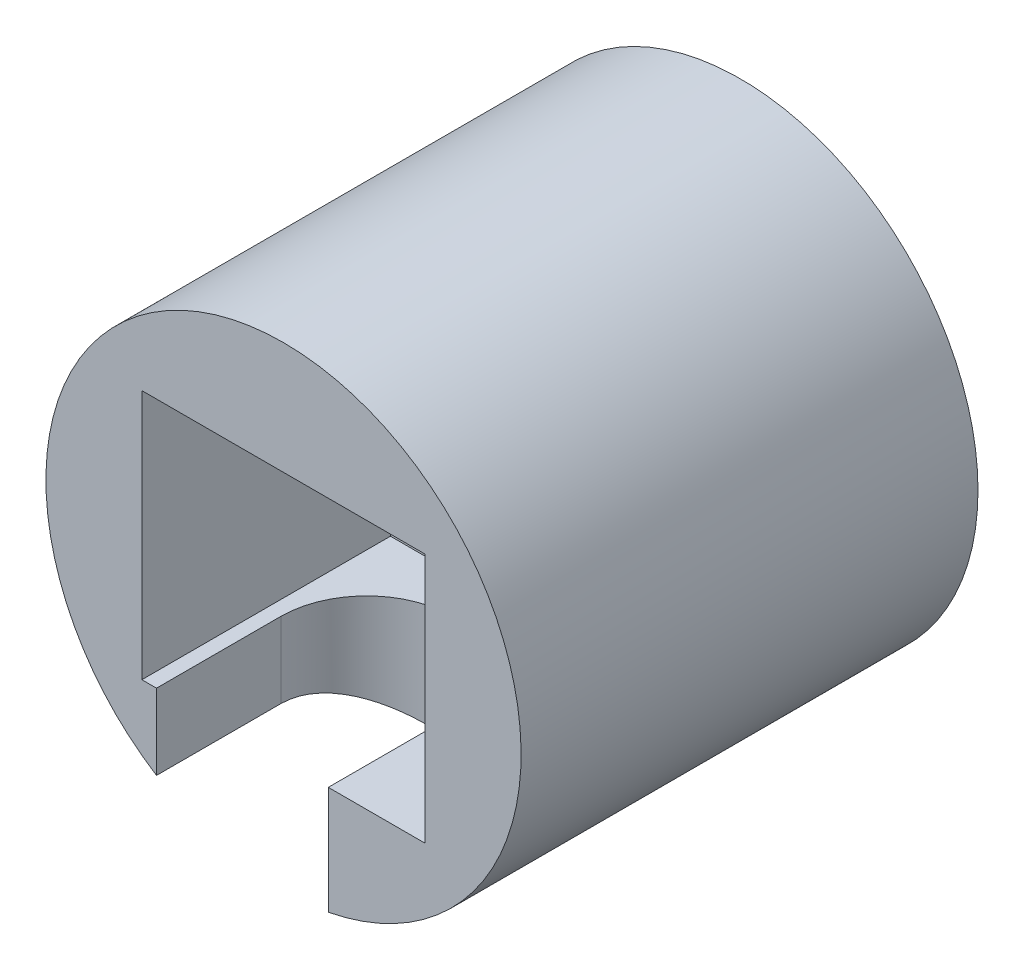
ISO-10303-21;
HEADER;
FILE_DESCRIPTION(('STEP AP214'),'2;1');
FILE_NAME('part.step','',(''),(''),'','','');
FILE_SCHEMA(('AUTOMOTIVE_DESIGN { 1 0 10303 214 1 1 1 1 }'));
ENDSEC;
DATA;
#1=APPLICATION_CONTEXT('core data for automotive mechanical design processes');
#2=APPLICATION_PROTOCOL_DEFINITION('international standard','automotive_design',2000,#1);
#3=PRODUCT_CONTEXT('',#1,'mechanical');
#4=PRODUCT('Part','Part','',(#3));
#5=PRODUCT_RELATED_PRODUCT_CATEGORY('part','',(#4));
#6=PRODUCT_DEFINITION_FORMATION('','',#4);
#7=PRODUCT_DEFINITION_CONTEXT('part definition',#1,'design');
#8=PRODUCT_DEFINITION('design','',#6,#7);
#9=PRODUCT_DEFINITION_SHAPE('','',#8);
#10=(LENGTH_UNIT() NAMED_UNIT(*) SI_UNIT(.MILLI.,.METRE.));
#11=(NAMED_UNIT(*) PLANE_ANGLE_UNIT() SI_UNIT($,.RADIAN.));
#12=(NAMED_UNIT(*) SI_UNIT($,.STERADIAN.) SOLID_ANGLE_UNIT());
#13=UNCERTAINTY_MEASURE_WITH_UNIT(LENGTH_MEASURE(1.E-05),#10,'distance_accuracy_value','');
#14=(GEOMETRIC_REPRESENTATION_CONTEXT(3) GLOBAL_UNCERTAINTY_ASSIGNED_CONTEXT((#13)) GLOBAL_UNIT_ASSIGNED_CONTEXT((#10,
#11,#12)) REPRESENTATION_CONTEXT('',''));
#15=CARTESIAN_POINT('',(0.,0.,0.));
#16=DIRECTION('',(0.,0.,1.));
#17=DIRECTION('',(1.,0.,0.));
#18=AXIS2_PLACEMENT_3D('',#15,#16,#17);
#19=CARTESIAN_POINT('',(0.,0.,25.));
#20=DIRECTION('',(0.,0.,1.));
#21=DIRECTION('',(1.,0.,0.));
#22=AXIS2_PLACEMENT_3D('',#19,#20,#21);
#23=PLANE('',#22);
#24=DIRECTION('',(0.,1.,0.));
#25=VECTOR('',#24,1.);
#26=CARTESIAN_POINT('',(2.44999999999998,-13.001,25.0000000000001));
#27=LINE('',#26,#25);
#28=CARTESIAN_POINT('',(2.44999999999998,-12.767047426872,25.0000000000001));
#29=VERTEX_POINT('',#28);
#30=CARTESIAN_POINT('',(2.44999999999998,-6.85,25.0000000000001));
#31=VERTEX_POINT('',#30);
#32=EDGE_CURVE('E116',#29,#31,#27,.T.);
#33=ORIENTED_EDGE('',*,*,#32,.F.);
#34=CARTESIAN_POINT('',(0.,0.,25.));
#35=DIRECTION('',(0.,0.,1.));
#36=DIRECTION('',(1.,0.,0.));
#37=AXIS2_PLACEMENT_3D('',#34,#35,#36);
#38=CIRCLE('',#37,13.);
#39=CARTESIAN_POINT('',(-6.95000000000002,-10.986241395491,25.0000000000001));
#40=VERTEX_POINT('',#39);
#41=EDGE_CURVE('E122',#29,#40,#38,.T.);
#42=ORIENTED_EDGE('',*,*,#41,.T.);
#43=DIRECTION('',(0.,1.,0.));
#44=VECTOR('',#43,1.);
#45=CARTESIAN_POINT('',(-6.95000000000002,-13.001,25.0000000000001));
#46=LINE('',#45,#44);
#47=CARTESIAN_POINT('',(-6.95000000000002,-6.85,25.0000000000001));
#48=VERTEX_POINT('',#47);
#49=EDGE_CURVE('E103',#40,#48,#46,.T.);
#50=ORIENTED_EDGE('',*,*,#49,.T.);
#51=DIRECTION('',(1.,0.,0.));
#52=VECTOR('',#51,1.);
#53=CARTESIAN_POINT('',(-7.75000000000015,-6.85,25.0000000000001));
#54=LINE('',#53,#52);
#55=CARTESIAN_POINT('',(-7.75000000000015,-6.85,25.0000000000001));
#56=VERTEX_POINT('',#55);
#57=EDGE_CURVE('E156',#56,#48,#54,.T.);
#58=ORIENTED_EDGE('',*,*,#57,.F.);
#59=DIRECTION('',(0.,1.,0.));
#60=VECTOR('',#59,1.);
#61=CARTESIAN_POINT('',(-7.75000000000015,-6.85,25.0000000000001));
#62=LINE('',#61,#60);
#63=CARTESIAN_POINT('',(-7.75000000000015,6.85,25.0000000000001));
#64=VERTEX_POINT('',#63);
#65=EDGE_CURVE('E145',#56,#64,#62,.T.);
#66=ORIENTED_EDGE('',*,*,#65,.T.);
#67=DIRECTION('',(1.,0.,0.));
#68=VECTOR('',#67,1.);
#69=CARTESIAN_POINT('',(-7.75000000000015,6.85,25.0000000000001));
#70=LINE('',#69,#68);
#71=CARTESIAN_POINT('',(7.74999999999986,6.85,25.));
#72=VERTEX_POINT('',#71);
#73=EDGE_CURVE('E125',#64,#72,#70,.T.);
#74=ORIENTED_EDGE('',*,*,#73,.T.);
#75=DIRECTION('',(0.,1.,0.));
#76=VECTOR('',#75,1.);
#77=CARTESIAN_POINT('',(7.74999999999986,-6.85,25.0000000000001));
#78=LINE('',#77,#76);
#79=CARTESIAN_POINT('',(7.74999999999986,-6.85,25.0000000000001));
#80=VERTEX_POINT('',#79);
#81=EDGE_CURVE('E177',#80,#72,#78,.T.);
#82=ORIENTED_EDGE('',*,*,#81,.F.);
#83=EDGE_CURVE('E163',#31,#80,#54,.T.);
#84=ORIENTED_EDGE('',*,*,#83,.F.);
#85=EDGE_LOOP('',(#33,#42,#50,#58,#66,#74,#82,#84));
#86=FACE_BOUND('',#85,.T.);
#87=ADVANCED_FACE('F39',(#86),#23,.T.);
#88=CARTESIAN_POINT('',(0.,0.,0.));
#89=DIRECTION('',(0.,0.,1.));
#90=DIRECTION('',(1.,0.,0.));
#91=AXIS2_PLACEMENT_3D('',#88,#89,#90);
#92=PLANE('',#91);
#93=CARTESIAN_POINT('',(0.,0.,0.));
#94=DIRECTION('',(0.,0.,1.));
#95=DIRECTION('',(1.,0.,0.));
#96=AXIS2_PLACEMENT_3D('',#93,#94,#95);
#97=CIRCLE('',#96,13.);
#98=CARTESIAN_POINT('',(13.,0.,0.));
#99=VERTEX_POINT('',#98);
#100=EDGE_CURVE('E131',#99,#99,#97,.T.);
#101=ORIENTED_EDGE('',*,*,#100,.F.);
#102=EDGE_LOOP('',(#101));
#103=FACE_BOUND('',#102,.T.);
#104=CARTESIAN_POINT('',(0.,0.,0.));
#105=DIRECTION('',(0.,0.,1.));
#106=DIRECTION('',(1.,0.,0.));
#107=AXIS2_PLACEMENT_3D('',#104,#105,#106);
#108=CIRCLE('',#107,3.);
#109=CARTESIAN_POINT('',(3.,0.,0.));
#110=VERTEX_POINT('',#109);
#111=EDGE_CURVE('E137',#110,#110,#108,.T.);
#112=ORIENTED_EDGE('',*,*,#111,.T.);
#113=EDGE_LOOP('',(#112));
#114=FACE_BOUND('',#113,.T.);
#115=ADVANCED_FACE('F244',(#103,#114),#92,.F.);
#116=CARTESIAN_POINT('',(0.,0.,25.));
#117=DIRECTION('',(0.,0.,-1.));
#118=DIRECTION('',(-1.,0.,0.));
#119=AXIS2_PLACEMENT_3D('',#116,#117,#118);
#120=CYLINDRICAL_SURFACE('',#119,13.);
#121=ORIENTED_EDGE('',*,*,#41,.F.);
#122=DIRECTION('',(0.,0.,-1.));
#123=VECTOR('',#122,1.);
#124=CARTESIAN_POINT('',(2.44999999999998,-12.767047426872,25.));
#125=LINE('',#124,#123);
#126=CARTESIAN_POINT('',(2.44999999999998,-12.767047426872,18.2));
#127=VERTEX_POINT('',#126);
#128=EDGE_CURVE('E126',#127,#29,#125,.F.);
#129=ORIENTED_EDGE('',*,*,#128,.F.);
#130=CARTESIAN_POINT('',(-6.95000000000002,-10.986241395491,18.2));
#131=CARTESIAN_POINT('',(-6.95002293277047,-10.9862101413099,18.0794937144867));
#132=CARTESIAN_POINT('',(-6.94536617343314,-10.9891724451402,17.9590067442839));
#133=CARTESIAN_POINT('',(-6.92687250748531,-11.0008478791062,17.7190914736104));
#134=CARTESIAN_POINT('',(-6.91304120923049,-11.0095574959177,17.5996625715161));
#135=CARTESIAN_POINT('',(-6.8764880646057,-11.0324225139389,17.3634497306772));
#136=CARTESIAN_POINT('',(-6.85382043977003,-11.0465446938168,17.246654170918));
#137=CARTESIAN_POINT('',(-6.79991842603917,-11.0798064516316,17.0158087461879));
#138=CARTESIAN_POINT('',(-6.76868308932211,-11.0989465846802,16.9017591865187));
#139=CARTESIAN_POINT('',(-6.66281770067882,-11.1630506256045,16.5653405251522));
#140=CARTESIAN_POINT('',(-6.57591365208651,-11.2147730665416,16.347978720706));
#141=CARTESIAN_POINT('',(-6.37269585525324,-11.3314796520538,15.9312206299358));
#142=CARTESIAN_POINT('',(-6.25633658705203,-11.3964842926187,15.7318528043078));
#143=CARTESIAN_POINT('',(-5.98638228962754,-11.5407339649325,15.3379804456123));
#144=CARTESIAN_POINT('',(-5.83045630953931,-11.620720972423,15.1453444605947));
#145=CARTESIAN_POINT('',(-5.49146908190111,-11.7847058657888,14.7877139107999));
#146=CARTESIAN_POINT('',(-5.30839821110796,-11.8687051668902,14.6227291931531));
#147=CARTESIAN_POINT('',(-4.89530506441212,-12.0454121427351,14.3054190514298));
#148=CARTESIAN_POINT('',(-4.66229412632271,-12.1379850223376,14.1568510474252));
#149=CARTESIAN_POINT('',(-4.29446133992722,-12.2708906279301,13.9656936327974));
#150=CARTESIAN_POINT('',(-4.16871494697715,-12.3142249526274,13.9072308195135));
#151=CARTESIAN_POINT('',(-3.91180103206324,-12.3982265963457,13.801399590448));
#152=CARTESIAN_POINT('',(-3.78063607415363,-12.438895153761,13.7540259964402));
#153=CARTESIAN_POINT('',(-3.51487079510043,-12.5165768066713,13.6712794297962));
#154=CARTESIAN_POINT('',(-3.38031006852302,-12.5536185123949,13.6358060698476));
#155=CARTESIAN_POINT('',(-3.10767087058296,-12.6238734863184,13.5768149897425));
#156=CARTESIAN_POINT('',(-2.96959403091655,-12.6570884921922,13.5532918264199));
#157=CARTESIAN_POINT('',(-2.6909841608342,-12.7192361932959,13.5186291490684));
#158=CARTESIAN_POINT('',(-2.55045192035152,-12.7481702384011,13.5074857242078));
#159=CARTESIAN_POINT('',(-2.26808705238904,-12.8014223644072,13.4979130110289));
#160=CARTESIAN_POINT('',(-2.12625454545391,-12.8257408687571,13.499482555792));
#161=CARTESIAN_POINT('',(-1.8546471069233,-12.8676934934988,13.5148537955609));
#162=CARTESIAN_POINT('',(-1.72487236520933,-12.8857201580522,13.5276040613335));
#163=CARTESIAN_POINT('',(-1.46629496870776,-12.9176992092879,13.5639612124383));
#164=CARTESIAN_POINT('',(-1.33749265320087,-12.9316502326621,13.5875717237555));
#165=CARTESIAN_POINT('',(-1.08203539847925,-12.9555258209228,13.6455511373607));
#166=CARTESIAN_POINT('',(-0.955379224400016,-12.9654527821934,13.6799136150363));
#167=CARTESIAN_POINT('',(-0.705120754444983,-12.9814688044434,13.7592136801633));
#168=CARTESIAN_POINT('',(-0.58151959487547,-12.9875564574414,13.8041551389351));
#169=CARTESIAN_POINT('',(-0.344116050034168,-12.9959619852313,13.9019414102465));
#170=CARTESIAN_POINT('',(-0.23012588129859,-12.9984431016966,13.9543173474344));
#171=CARTESIAN_POINT('',(-0.00663905858379327,-13.0004788445469,14.0680441532356));
#172=CARTESIAN_POINT('',(0.102855980477346,-13.0000324282876,14.1293982118108));
#173=CARTESIAN_POINT('',(0.316530852664359,-12.9965849424394,14.2606309273999));
#174=CARTESIAN_POINT('',(0.420712239995293,-12.9935846244433,14.3305070712502));
#175=CARTESIAN_POINT('',(0.623120358020433,-12.9854533392698,14.478319097185));
#176=CARTESIAN_POINT('',(0.721344944479465,-12.9803216100166,14.5562578545255));
#177=CARTESIAN_POINT('',(1.00999605455145,-12.9621565485607,14.8047603589839));
#178=CARTESIAN_POINT('',(1.19010296246508,-12.9464552838993,14.9873741806517));
#179=CARTESIAN_POINT('',(1.51816484749345,-12.9121078154688,15.3793120370098));
#180=CARTESIAN_POINT('',(1.66611030566739,-12.8934607426303,15.5886439505339));
#181=CARTESIAN_POINT('',(1.86322176002551,-12.8659622091582,15.9220879277918));
#182=CARTESIAN_POINT('',(1.92559113298555,-12.8567283315949,16.0385447594643));
#183=CARTESIAN_POINT('',(2.04032378114996,-12.8390207116229,16.276325538607));
#184=CARTESIAN_POINT('',(2.09269058466123,-12.83054670174,16.3976477515233));
#185=CARTESIAN_POINT('',(2.18701907154318,-12.81480541622,16.6442726852288));
#186=CARTESIAN_POINT('',(2.22898594421918,-12.8075375393532,16.7695733854983));
#187=CARTESIAN_POINT('',(2.30223046026469,-12.7945732702191,17.0232959591744));
#188=CARTESIAN_POINT('',(2.33351142900117,-12.7888763891772,17.1517168482542));
#189=CARTESIAN_POINT('',(2.38945993287764,-12.778555607137,17.4324425077304));
#190=CARTESIAN_POINT('',(2.41215331195468,-12.7742693062974,17.5851573422647));
#191=CARTESIAN_POINT('',(2.44242891063724,-12.7684993767742,17.8919172756454));
#192=CARTESIAN_POINT('',(2.45003173726602,-12.7670119262431,18.0459602715179));
#193=CARTESIAN_POINT('',(2.44999999999998,-12.767047426872,18.2));
#194=B_SPLINE_CURVE_WITH_KNOTS('',3,(#130,#131,#132,#133,#134,#135,#136,#137,#138,#139,#140,
#141,#142,#143,#144,#145,#146,#147,#148,#149,#150,#151,#152,#153,#154,#155,#156,#157,#158,#159,
#160,#161,#162,#163,#164,#165,#166,#167,#168,#169,#170,#171,#172,#173,#174,#175,#176,#177,#178,
#179,#180,#181,#182,#183,#184,#185,#186,#187,#188,#189,#190,#191,#192,#193),.UNSPECIFIED.,.F.,
.F.,(4,2,2,2,2,2,2,2,2,2,2,2,2,2,2,2,2,2,2,2,2,2,2,2,2,2,2,2,2,2,2,4),(0.,0.361360862381426,
0.722501029764996,1.08145919142757,1.44045707964926,2.15627416190179,2.87320429091728,
3.65134553919581,4.42976331192294,5.29952604252408,5.73494171046149,6.17015364911609,
6.60159607849655,7.03284181461936,7.46395127892198,7.89502117230093,8.28943782960277,
8.68398626919918,9.07829940339831,9.47275705927328,9.84873566963556,10.2248481925024,
10.600850066742,10.9769864945108,11.7442038507513,12.5116479748572,12.9085374055134,
13.3052865777811,13.7018373817115,14.0982646695801,14.5608329723231,15.0227691754902),.UNSPECIFIED.);
#195=CARTESIAN_POINT('',(-6.95000000000002,-10.986241395491,18.2));
#196=VERTEX_POINT('',#195);
#197=EDGE_CURVE('E115',#196,#127,#194,.T.);
#198=ORIENTED_EDGE('',*,*,#197,.F.);
#199=DIRECTION('',(0.,0.,-1.));
#200=VECTOR('',#199,1.);
#201=CARTESIAN_POINT('',(-6.95000000000002,-10.986241395491,25.));
#202=LINE('',#201,#200);
#203=EDGE_CURVE('E106',#40,#196,#202,.T.);
#204=ORIENTED_EDGE('',*,*,#203,.F.);
#205=EDGE_LOOP('',(#121,#129,#198,#204));
#206=FACE_BOUND('',#205,.T.);
#207=ORIENTED_EDGE('',*,*,#100,.T.);
#208=EDGE_LOOP('',(#207));
#209=FACE_BOUND('',#208,.T.);
#210=ADVANCED_FACE('F41',(#206,#209),#120,.T.);
#211=CARTESIAN_POINT('',(0.,0.,25.));
#212=DIRECTION('',(0.,0.,-1.));
#213=DIRECTION('',(-1.,0.,0.));
#214=AXIS2_PLACEMENT_3D('',#211,#212,#213);
#215=CYLINDRICAL_SURFACE('',#214,3.);
#216=CARTESIAN_POINT('',(0.,0.,11.4000000000001));
#217=DIRECTION('',(0.,0.,-1.));
#218=DIRECTION('',(-1.,0.,0.));
#219=AXIS2_PLACEMENT_3D('',#216,#217,#218);
#220=CIRCLE('',#219,3.);
#221=CARTESIAN_POINT('',(-3.,0.,11.4000000000001));
#222=VERTEX_POINT('',#221);
#223=EDGE_CURVE('E142',#222,#222,#220,.T.);
#224=ORIENTED_EDGE('',*,*,#223,.F.);
#225=EDGE_LOOP('',(#224));
#226=FACE_BOUND('',#225,.T.);
#227=ORIENTED_EDGE('',*,*,#111,.F.);
#228=EDGE_LOOP('',(#227));
#229=FACE_BOUND('',#228,.T.);
#230=ADVANCED_FACE('F234',(#226,#229),#215,.F.);
#231=CARTESIAN_POINT('',(-7.75000000000015,-6.85,25.0000000000001));
#232=DIRECTION('',(-1.,0.,0.));
#233=DIRECTION('',(0.,0.,1.));
#234=AXIS2_PLACEMENT_3D('',#231,#232,#233);
#235=PLANE('',#234);
#236=DIRECTION('',(0.,0.,1.));
#237=VECTOR('',#236,1.);
#238=CARTESIAN_POINT('',(-7.75000000000015,6.85,25.0000000000001));
#239=LINE('',#238,#237);
#240=CARTESIAN_POINT('',(-7.75000000000015,6.85,11.4000000000001));
#241=VERTEX_POINT('',#240);
#242=EDGE_CURVE('E170',#241,#64,#239,.T.);
#243=ORIENTED_EDGE('',*,*,#242,.T.);
#244=ORIENTED_EDGE('',*,*,#65,.F.);
#245=DIRECTION('',(0.,0.,1.));
#246=VECTOR('',#245,1.);
#247=CARTESIAN_POINT('',(-7.75000000000015,-6.85,25.0000000000001));
#248=LINE('',#247,#246);
#249=CARTESIAN_POINT('',(-7.75000000000015,-6.85,11.4000000000001));
#250=VERTEX_POINT('',#249);
#251=EDGE_CURVE('E159',#250,#56,#248,.T.);
#252=ORIENTED_EDGE('',*,*,#251,.F.);
#253=DIRECTION('',(0.,1.,0.));
#254=VECTOR('',#253,1.);
#255=CARTESIAN_POINT('',(-7.75000000000015,-6.85,11.4000000000001));
#256=LINE('',#255,#254);
#257=EDGE_CURVE('E192',#250,#241,#256,.T.);
#258=ORIENTED_EDGE('',*,*,#257,.T.);
#259=EDGE_LOOP('',(#243,#244,#252,#258));
#260=FACE_BOUND('',#259,.T.);
#261=ADVANCED_FACE('F205',(#260),#235,.F.);
#262=CARTESIAN_POINT('',(-7.75000000000015,-6.85,11.4000000000001));
#263=DIRECTION('',(0.,0.,-1.));
#264=DIRECTION('',(-1.,0.,0.));
#265=AXIS2_PLACEMENT_3D('',#262,#263,#264);
#266=PLANE('',#265);
#267=ORIENTED_EDGE('',*,*,#223,.T.);
#268=EDGE_LOOP('',(#267));
#269=FACE_BOUND('',#268,.T.);
#270=DIRECTION('',(-1.,0.,0.));
#271=VECTOR('',#270,1.);
#272=CARTESIAN_POINT('',(-7.75000000000015,6.85,11.4000000000001));
#273=LINE('',#272,#271);
#274=CARTESIAN_POINT('',(7.74999999999986,6.85,11.4000000000001));
#275=VERTEX_POINT('',#274);
#276=EDGE_CURVE('E183',#275,#241,#273,.T.);
#277=ORIENTED_EDGE('',*,*,#276,.T.);
#278=ORIENTED_EDGE('',*,*,#257,.F.);
#279=DIRECTION('',(-1.,0.,0.));
#280=VECTOR('',#279,1.);
#281=CARTESIAN_POINT('',(-7.75000000000015,-6.85,11.4000000000001));
#282=LINE('',#281,#280);
#283=CARTESIAN_POINT('',(7.74999999999986,-6.85,11.4000000000001));
#284=VERTEX_POINT('',#283);
#285=EDGE_CURVE('E168',#284,#250,#282,.T.);
#286=ORIENTED_EDGE('',*,*,#285,.F.);
#287=DIRECTION('',(0.,1.,0.));
#288=VECTOR('',#287,1.);
#289=CARTESIAN_POINT('',(7.74999999999986,-6.85,11.4000000000001));
#290=LINE('',#289,#288);
#291=EDGE_CURVE('E195',#284,#275,#290,.T.);
#292=ORIENTED_EDGE('',*,*,#291,.T.);
#293=EDGE_LOOP('',(#277,#278,#286,#292));
#294=FACE_BOUND('',#293,.T.);
#295=ADVANCED_FACE('F208',(#269,#294),#266,.F.);
#296=CARTESIAN_POINT('',(7.74999999999986,-6.85,25.0000000000001));
#297=DIRECTION('',(1.,0.,0.));
#298=DIRECTION('',(0.,0.,-1.));
#299=AXIS2_PLACEMENT_3D('',#296,#297,#298);
#300=PLANE('',#299);
#301=DIRECTION('',(0.,0.,-1.));
#302=VECTOR('',#301,1.);
#303=CARTESIAN_POINT('',(7.74999999999986,6.85,25.0000000000001));
#304=LINE('',#303,#302);
#305=EDGE_CURVE('E63',#72,#275,#304,.T.);
#306=ORIENTED_EDGE('',*,*,#305,.T.);
#307=ORIENTED_EDGE('',*,*,#291,.F.);
#308=DIRECTION('',(0.,0.,-1.));
#309=VECTOR('',#308,1.);
#310=CARTESIAN_POINT('',(7.74999999999986,-6.85,25.0000000000001));
#311=LINE('',#310,#309);
#312=EDGE_CURVE('E162',#80,#284,#311,.T.);
#313=ORIENTED_EDGE('',*,*,#312,.F.);
#314=ORIENTED_EDGE('',*,*,#81,.T.);
#315=EDGE_LOOP('',(#306,#307,#313,#314));
#316=FACE_BOUND('',#315,.T.);
#317=ADVANCED_FACE('F201',(#316),#300,.F.);
#318=CARTESIAN_POINT('',(0.,-6.85,0.));
#319=DIRECTION('',(0.,1.,0.));
#320=DIRECTION('',(0.,0.,1.));
#321=AXIS2_PLACEMENT_3D('',#318,#319,#320);
#322=PLANE('',#321);
#323=DIRECTION('',(0.,0.,-1.));
#324=VECTOR('',#323,1.);
#325=CARTESIAN_POINT('',(2.44999999999997,-6.85,0.));
#326=LINE('',#325,#324);
#327=CARTESIAN_POINT('',(2.44999999999998,-6.85,18.2));
#328=VERTEX_POINT('',#327);
#329=EDGE_CURVE('E11',#31,#328,#326,.T.);
#330=ORIENTED_EDGE('',*,*,#329,.F.);
#331=ORIENTED_EDGE('',*,*,#83,.T.);
#332=ORIENTED_EDGE('',*,*,#312,.T.);
#333=ORIENTED_EDGE('',*,*,#285,.T.);
#334=ORIENTED_EDGE('',*,*,#251,.T.);
#335=ORIENTED_EDGE('',*,*,#57,.T.);
#336=DIRECTION('',(0.,0.,1.));
#337=VECTOR('',#336,1.);
#338=CARTESIAN_POINT('',(-6.95000000000002,-6.85,0.));
#339=LINE('',#338,#337);
#340=CARTESIAN_POINT('',(-6.95000000000002,-6.85,18.2));
#341=VERTEX_POINT('',#340);
#342=EDGE_CURVE('E109',#341,#48,#339,.T.);
#343=ORIENTED_EDGE('',*,*,#342,.F.);
#344=CARTESIAN_POINT('',(-2.25000000000002,-6.85,18.2));
#345=DIRECTION('',(0.,1.,0.));
#346=DIRECTION('',(0.,0.,1.));
#347=AXIS2_PLACEMENT_3D('',#344,#345,#346);
#348=CIRCLE('',#347,4.7);
#349=EDGE_CURVE('E48',#328,#341,#348,.T.);
#350=ORIENTED_EDGE('',*,*,#349,.F.);
#351=EDGE_LOOP('',(#330,#331,#332,#333,#334,#335,#343,#350));
#352=FACE_BOUND('',#351,.T.);
#353=ADVANCED_FACE('F154',(#352),#322,.T.);
#354=CARTESIAN_POINT('',(0.,6.85,0.));
#355=DIRECTION('',(0.,1.,0.));
#356=DIRECTION('',(0.,0.,1.));
#357=AXIS2_PLACEMENT_3D('',#354,#355,#356);
#358=PLANE('',#357);
#359=ORIENTED_EDGE('',*,*,#73,.F.);
#360=ORIENTED_EDGE('',*,*,#242,.F.);
#361=ORIENTED_EDGE('',*,*,#276,.F.);
#362=ORIENTED_EDGE('',*,*,#305,.F.);
#363=EDGE_LOOP('',(#359,#360,#361,#362));
#364=FACE_BOUND('',#363,.T.);
#365=ADVANCED_FACE('F203',(#364),#358,.F.);
#366=CARTESIAN_POINT('',(-2.25000000000002,-13.001,18.2));
#367=DIRECTION('',(0.,1.,0.));
#368=DIRECTION('',(0.,0.,1.));
#369=AXIS2_PLACEMENT_3D('',#366,#367,#368);
#370=CYLINDRICAL_SURFACE('',#369,4.7);
#371=ORIENTED_EDGE('',*,*,#349,.T.);
#372=DIRECTION('',(0.,1.,0.));
#373=VECTOR('',#372,1.);
#374=CARTESIAN_POINT('',(-6.95000000000002,-13.001,18.2));
#375=LINE('',#374,#373);
#376=EDGE_CURVE('E55',#196,#341,#375,.T.);
#377=ORIENTED_EDGE('',*,*,#376,.F.);
#378=ORIENTED_EDGE('',*,*,#197,.T.);
#379=DIRECTION('',(0.,1.,0.));
#380=VECTOR('',#379,1.);
#381=CARTESIAN_POINT('',(2.44999999999998,-13.001,18.2));
#382=LINE('',#381,#380);
#383=EDGE_CURVE('E151',#127,#328,#382,.T.);
#384=ORIENTED_EDGE('',*,*,#383,.T.);
#385=EDGE_LOOP('',(#371,#377,#378,#384));
#386=FACE_BOUND('',#385,.T.);
#387=ADVANCED_FACE('F150',(#386),#370,.F.);
#388=CARTESIAN_POINT('',(2.44999999999998,-13.001,18.2));
#389=DIRECTION('',(1.,0.,0.));
#390=DIRECTION('',(0.,0.,-1.));
#391=AXIS2_PLACEMENT_3D('',#388,#389,#390);
#392=PLANE('',#391);
#393=ORIENTED_EDGE('',*,*,#329,.T.);
#394=ORIENTED_EDGE('',*,*,#383,.F.);
#395=ORIENTED_EDGE('',*,*,#128,.T.);
#396=ORIENTED_EDGE('',*,*,#32,.T.);
#397=EDGE_LOOP('',(#393,#394,#395,#396));
#398=FACE_BOUND('',#397,.T.);
#399=ADVANCED_FACE('F210',(#398),#392,.F.);
#400=CARTESIAN_POINT('',(-6.95000000000002,-13.001,18.2));
#401=DIRECTION('',(-1.,0.,0.));
#402=DIRECTION('',(0.,0.,1.));
#403=AXIS2_PLACEMENT_3D('',#400,#401,#402);
#404=PLANE('',#403);
#405=ORIENTED_EDGE('',*,*,#342,.T.);
#406=ORIENTED_EDGE('',*,*,#49,.F.);
#407=ORIENTED_EDGE('',*,*,#203,.T.);
#408=ORIENTED_EDGE('',*,*,#376,.T.);
#409=EDGE_LOOP('',(#405,#406,#407,#408));
#410=FACE_BOUND('',#409,.T.);
#411=ADVANCED_FACE('F105',(#410),#404,.F.);
#412=CLOSED_SHELL('',(#87,#115,#210,#230,#261,#295,#317,#353,#365,#387,#399,#411));
#413=MANIFOLD_SOLID_BREP('B2',#412);
#414=ADVANCED_BREP_SHAPE_REPRESENTATION('',(#18,#413),#14);
#415=SHAPE_DEFINITION_REPRESENTATION(#9,#414);
ENDSEC;
END-ISO-10303-21;
